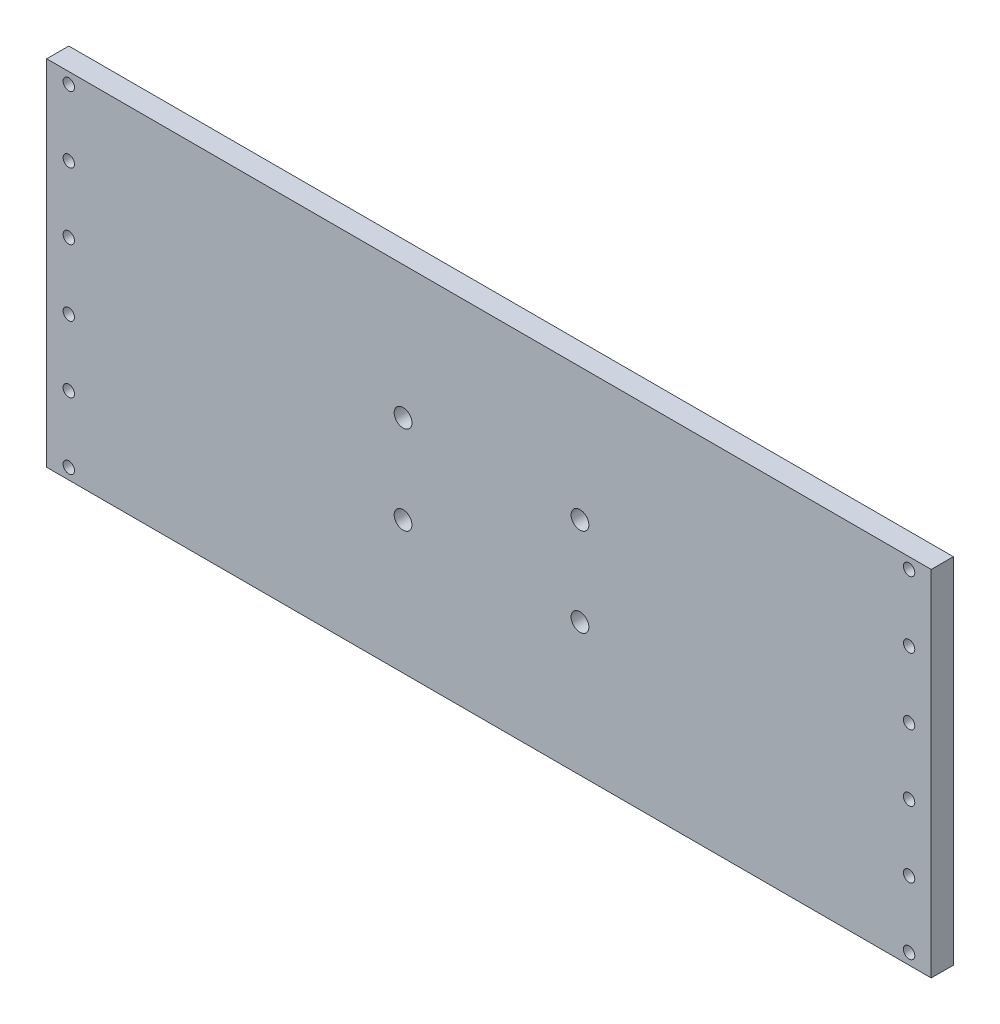
ISO-10303-21;
HEADER;
FILE_DESCRIPTION(('STEP AP214'),'2;1');
FILE_NAME('part.step','',(''),(''),'','','');
FILE_SCHEMA(('AUTOMOTIVE_DESIGN { 1 0 10303 214 1 1 1 1 }'));
ENDSEC;
DATA;
#1=APPLICATION_CONTEXT('core data for automotive mechanical design processes');
#2=APPLICATION_PROTOCOL_DEFINITION('international standard','automotive_design',2000,#1);
#3=PRODUCT_CONTEXT('',#1,'mechanical');
#4=PRODUCT('Part','Part','',(#3));
#5=PRODUCT_RELATED_PRODUCT_CATEGORY('part','',(#4));
#6=PRODUCT_DEFINITION_FORMATION('','',#4);
#7=PRODUCT_DEFINITION_CONTEXT('part definition',#1,'design');
#8=PRODUCT_DEFINITION('design','',#6,#7);
#9=PRODUCT_DEFINITION_SHAPE('','',#8);
#10=(LENGTH_UNIT() NAMED_UNIT(*) SI_UNIT(.MILLI.,.METRE.));
#11=(NAMED_UNIT(*) PLANE_ANGLE_UNIT() SI_UNIT($,.RADIAN.));
#12=(NAMED_UNIT(*) SI_UNIT($,.STERADIAN.) SOLID_ANGLE_UNIT());
#13=UNCERTAINTY_MEASURE_WITH_UNIT(LENGTH_MEASURE(1.E-05),#10,'distance_accuracy_value','');
#14=(GEOMETRIC_REPRESENTATION_CONTEXT(3) GLOBAL_UNCERTAINTY_ASSIGNED_CONTEXT((#13)) GLOBAL_UNIT_ASSIGNED_CONTEXT((#10,
#11,#12)) REPRESENTATION_CONTEXT('',''));
#15=CARTESIAN_POINT('',(0.,0.,0.));
#16=DIRECTION('',(0.,0.,1.));
#17=DIRECTION('',(1.,0.,0.));
#18=AXIS2_PLACEMENT_3D('',#15,#16,#17);
#19=CARTESIAN_POINT('',(127.,50.8,3.175));
#20=DIRECTION('',(-1.,0.,0.));
#21=DIRECTION('',(0.,0.,1.));
#22=AXIS2_PLACEMENT_3D('',#19,#20,#21);
#23=PLANE('',#22);
#24=DIRECTION('',(0.,1.,0.));
#25=VECTOR('',#24,1.);
#26=CARTESIAN_POINT('',(127.,50.8,-3.175));
#27=LINE('',#26,#25);
#28=CARTESIAN_POINT('',(127.,-50.8,-3.175));
#29=VERTEX_POINT('',#28);
#30=CARTESIAN_POINT('',(127.,50.8,-3.175));
#31=VERTEX_POINT('',#30);
#32=EDGE_CURVE('E98',#29,#31,#27,.T.);
#33=ORIENTED_EDGE('',*,*,#32,.T.);
#34=DIRECTION('',(0.,0.,-1.));
#35=VECTOR('',#34,1.);
#36=CARTESIAN_POINT('',(127.,50.8,3.175));
#37=LINE('',#36,#35);
#38=CARTESIAN_POINT('',(127.,50.8,3.175));
#39=VERTEX_POINT('',#38);
#40=EDGE_CURVE('E11',#39,#31,#37,.T.);
#41=ORIENTED_EDGE('',*,*,#40,.F.);
#42=DIRECTION('',(0.,1.,0.));
#43=VECTOR('',#42,1.);
#44=CARTESIAN_POINT('',(127.,50.8,3.175));
#45=LINE('',#44,#43);
#46=CARTESIAN_POINT('',(127.,-50.8,3.175));
#47=VERTEX_POINT('',#46);
#48=EDGE_CURVE('E86',#47,#39,#45,.T.);
#49=ORIENTED_EDGE('',*,*,#48,.F.);
#50=DIRECTION('',(0.,0.,-1.));
#51=VECTOR('',#50,1.);
#52=CARTESIAN_POINT('',(127.,-50.8,3.175));
#53=LINE('',#52,#51);
#54=EDGE_CURVE('E94',#47,#29,#53,.T.);
#55=ORIENTED_EDGE('',*,*,#54,.T.);
#56=EDGE_LOOP('',(#33,#41,#49,#55));
#57=FACE_BOUND('',#56,.T.);
#58=ADVANCED_FACE('F35',(#57),#23,.F.);
#59=CARTESIAN_POINT('',(-127.,50.8,3.175));
#60=DIRECTION('',(0.,-1.,0.));
#61=DIRECTION('',(0.,0.,-1.));
#62=AXIS2_PLACEMENT_3D('',#59,#60,#61);
#63=PLANE('',#62);
#64=DIRECTION('',(-1.,0.,0.));
#65=VECTOR('',#64,1.);
#66=CARTESIAN_POINT('',(-127.,50.8,-3.175));
#67=LINE('',#66,#65);
#68=CARTESIAN_POINT('',(-127.,50.8,-3.175));
#69=VERTEX_POINT('',#68);
#70=EDGE_CURVE('E90',#31,#69,#67,.T.);
#71=ORIENTED_EDGE('',*,*,#70,.T.);
#72=DIRECTION('',(0.,0.,-1.));
#73=VECTOR('',#72,1.);
#74=CARTESIAN_POINT('',(-127.,50.8,3.175));
#75=LINE('',#74,#73);
#76=CARTESIAN_POINT('',(-127.,50.8,3.175));
#77=VERTEX_POINT('',#76);
#78=EDGE_CURVE('E43',#77,#69,#75,.T.);
#79=ORIENTED_EDGE('',*,*,#78,.F.);
#80=DIRECTION('',(-1.,0.,0.));
#81=VECTOR('',#80,1.);
#82=CARTESIAN_POINT('',(-127.,50.8,3.175));
#83=LINE('',#82,#81);
#84=EDGE_CURVE('E81',#39,#77,#83,.T.);
#85=ORIENTED_EDGE('',*,*,#84,.F.);
#86=ORIENTED_EDGE('',*,*,#40,.T.);
#87=EDGE_LOOP('',(#71,#79,#85,#86));
#88=FACE_BOUND('',#87,.T.);
#89=ADVANCED_FACE('F89',(#88),#63,.F.);
#90=CARTESIAN_POINT('',(-127.,50.8,3.175));
#91=DIRECTION('',(1.,0.,0.));
#92=DIRECTION('',(0.,0.,-1.));
#93=AXIS2_PLACEMENT_3D('',#90,#91,#92);
#94=PLANE('',#93);
#95=DIRECTION('',(0.,-1.,0.));
#96=VECTOR('',#95,1.);
#97=CARTESIAN_POINT('',(-127.,50.8,-3.175));
#98=LINE('',#97,#96);
#99=CARTESIAN_POINT('',(-127.,-50.8,-3.175));
#100=VERTEX_POINT('',#99);
#101=EDGE_CURVE('E68',#69,#100,#98,.T.);
#102=ORIENTED_EDGE('',*,*,#101,.T.);
#103=DIRECTION('',(0.,0.,-1.));
#104=VECTOR('',#103,1.);
#105=CARTESIAN_POINT('',(-127.,-50.8,3.175));
#106=LINE('',#105,#104);
#107=CARTESIAN_POINT('',(-127.,-50.8,3.175));
#108=VERTEX_POINT('',#107);
#109=EDGE_CURVE('E91',#108,#100,#106,.T.);
#110=ORIENTED_EDGE('',*,*,#109,.F.);
#111=DIRECTION('',(0.,-1.,0.));
#112=VECTOR('',#111,1.);
#113=CARTESIAN_POINT('',(-127.,50.8,3.175));
#114=LINE('',#113,#112);
#115=EDGE_CURVE('E84',#77,#108,#114,.T.);
#116=ORIENTED_EDGE('',*,*,#115,.F.);
#117=ORIENTED_EDGE('',*,*,#78,.T.);
#118=EDGE_LOOP('',(#102,#110,#116,#117));
#119=FACE_BOUND('',#118,.T.);
#120=ADVANCED_FACE('F92',(#119),#94,.F.);
#121=CARTESIAN_POINT('',(-127.,-50.8,3.175));
#122=DIRECTION('',(0.,1.,0.));
#123=DIRECTION('',(0.,0.,1.));
#124=AXIS2_PLACEMENT_3D('',#121,#122,#123);
#125=PLANE('',#124);
#126=DIRECTION('',(1.,0.,0.));
#127=VECTOR('',#126,1.);
#128=CARTESIAN_POINT('',(-127.,-50.8,-3.175));
#129=LINE('',#128,#127);
#130=EDGE_CURVE('E74',#100,#29,#129,.T.);
#131=ORIENTED_EDGE('',*,*,#130,.T.);
#132=ORIENTED_EDGE('',*,*,#54,.F.);
#133=DIRECTION('',(1.,0.,0.));
#134=VECTOR('',#133,1.);
#135=CARTESIAN_POINT('',(-127.,-50.8,3.175));
#136=LINE('',#135,#134);
#137=EDGE_CURVE('E51',#108,#47,#136,.T.);
#138=ORIENTED_EDGE('',*,*,#137,.F.);
#139=ORIENTED_EDGE('',*,*,#109,.T.);
#140=EDGE_LOOP('',(#131,#132,#138,#139));
#141=FACE_BOUND('',#140,.T.);
#142=ADVANCED_FACE('F106',(#141),#125,.F.);
#143=CARTESIAN_POINT('',(0.,0.,3.175));
#144=DIRECTION('',(0.,0.,1.));
#145=DIRECTION('',(1.,0.,0.));
#146=AXIS2_PLACEMENT_3D('',#143,#144,#145);
#147=PLANE('',#146);
#148=CARTESIAN_POINT('',(-24.6594840209027,12.7,3.175));
#149=DIRECTION('',(0.,0.,1.));
#150=DIRECTION('',(1.,0.,0.));
#151=AXIS2_PLACEMENT_3D('',#148,#149,#150);
#152=CIRCLE('',#151,2.55269999999999);
#153=CARTESIAN_POINT('',(-22.1067840209027,12.7,3.175));
#154=VERTEX_POINT('',#153);
#155=EDGE_CURVE('E204',#154,#154,#152,.T.);
#156=ORIENTED_EDGE('',*,*,#155,.F.);
#157=EDGE_LOOP('',(#156));
#158=FACE_BOUND('',#157,.T.);
#159=CARTESIAN_POINT('',(26.1405159790973,12.7,3.175));
#160=DIRECTION('',(0.,0.,1.));
#161=DIRECTION('',(1.,0.,0.));
#162=AXIS2_PLACEMENT_3D('',#159,#160,#161);
#163=CIRCLE('',#162,2.55269999999999);
#164=CARTESIAN_POINT('',(28.6932159790973,12.7,3.175));
#165=VERTEX_POINT('',#164);
#166=EDGE_CURVE('E198',#165,#165,#163,.T.);
#167=ORIENTED_EDGE('',*,*,#166,.F.);
#168=EDGE_LOOP('',(#167));
#169=FACE_BOUND('',#168,.T.);
#170=CARTESIAN_POINT('',(26.1405159790973,-12.7,3.175));
#171=DIRECTION('',(0.,0.,1.));
#172=DIRECTION('',(1.,0.,0.));
#173=AXIS2_PLACEMENT_3D('',#170,#171,#172);
#174=CIRCLE('',#173,2.55269999999999);
#175=CARTESIAN_POINT('',(28.6932159790973,-12.7,3.175));
#176=VERTEX_POINT('',#175);
#177=EDGE_CURVE('E192',#176,#176,#174,.T.);
#178=ORIENTED_EDGE('',*,*,#177,.F.);
#179=EDGE_LOOP('',(#178));
#180=FACE_BOUND('',#179,.T.);
#181=CARTESIAN_POINT('',(-24.6594840209027,-12.7,3.175));
#182=DIRECTION('',(0.,0.,1.));
#183=DIRECTION('',(1.,0.,0.));
#184=AXIS2_PLACEMENT_3D('',#181,#182,#183);
#185=CIRCLE('',#184,2.55269999999999);
#186=CARTESIAN_POINT('',(-22.1067840209027,-12.7,3.175));
#187=VERTEX_POINT('',#186);
#188=EDGE_CURVE('E186',#187,#187,#185,.T.);
#189=ORIENTED_EDGE('',*,*,#188,.F.);
#190=EDGE_LOOP('',(#189));
#191=FACE_BOUND('',#190,.T.);
#192=CARTESIAN_POINT('',(120.65,47.625,3.175));
#193=DIRECTION('',(0.,0.,1.));
#194=DIRECTION('',(1.,0.,0.));
#195=AXIS2_PLACEMENT_3D('',#192,#193,#194);
#196=CIRCLE('',#195,1.63194999999999);
#197=CARTESIAN_POINT('',(122.28195,47.625,3.175));
#198=VERTEX_POINT('',#197);
#199=EDGE_CURVE('E180',#198,#198,#196,.T.);
#200=ORIENTED_EDGE('',*,*,#199,.F.);
#201=EDGE_LOOP('',(#200));
#202=FACE_BOUND('',#201,.T.);
#203=CARTESIAN_POINT('',(120.65,28.575,3.175));
#204=DIRECTION('',(0.,0.,1.));
#205=DIRECTION('',(1.,0.,0.));
#206=AXIS2_PLACEMENT_3D('',#203,#204,#205);
#207=CIRCLE('',#206,1.63194999999999);
#208=CARTESIAN_POINT('',(122.28195,28.575,3.175));
#209=VERTEX_POINT('',#208);
#210=EDGE_CURVE('E174',#209,#209,#207,.T.);
#211=ORIENTED_EDGE('',*,*,#210,.F.);
#212=EDGE_LOOP('',(#211));
#213=FACE_BOUND('',#212,.T.);
#214=CARTESIAN_POINT('',(120.65,9.525,3.175));
#215=DIRECTION('',(0.,0.,1.));
#216=DIRECTION('',(1.,0.,0.));
#217=AXIS2_PLACEMENT_3D('',#214,#215,#216);
#218=CIRCLE('',#217,1.63194999999999);
#219=CARTESIAN_POINT('',(122.28195,9.525,3.175));
#220=VERTEX_POINT('',#219);
#221=EDGE_CURVE('E168',#220,#220,#218,.T.);
#222=ORIENTED_EDGE('',*,*,#221,.F.);
#223=EDGE_LOOP('',(#222));
#224=FACE_BOUND('',#223,.T.);
#225=CARTESIAN_POINT('',(120.649999999999,-9.52500000000001,3.175));
#226=DIRECTION('',(0.,0.,1.));
#227=DIRECTION('',(1.,0.,0.));
#228=AXIS2_PLACEMENT_3D('',#225,#226,#227);
#229=CIRCLE('',#228,1.63194999999999);
#230=CARTESIAN_POINT('',(122.281949999999,-9.52500000000001,3.175));
#231=VERTEX_POINT('',#230);
#232=EDGE_CURVE('E162',#231,#231,#229,.T.);
#233=ORIENTED_EDGE('',*,*,#232,.F.);
#234=EDGE_LOOP('',(#233));
#235=FACE_BOUND('',#234,.T.);
#236=CARTESIAN_POINT('',(120.649999999999,-28.575,3.175));
#237=DIRECTION('',(0.,0.,1.));
#238=DIRECTION('',(1.,0.,0.));
#239=AXIS2_PLACEMENT_3D('',#236,#237,#238);
#240=CIRCLE('',#239,1.63194999999999);
#241=CARTESIAN_POINT('',(122.281949999999,-28.575,3.175));
#242=VERTEX_POINT('',#241);
#243=EDGE_CURVE('E156',#242,#242,#240,.T.);
#244=ORIENTED_EDGE('',*,*,#243,.F.);
#245=EDGE_LOOP('',(#244));
#246=FACE_BOUND('',#245,.T.);
#247=CARTESIAN_POINT('',(120.649999999999,-47.625,3.175));
#248=DIRECTION('',(0.,0.,1.));
#249=DIRECTION('',(1.,0.,0.));
#250=AXIS2_PLACEMENT_3D('',#247,#248,#249);
#251=CIRCLE('',#250,1.63194999999999);
#252=CARTESIAN_POINT('',(122.281949999999,-47.625,3.175));
#253=VERTEX_POINT('',#252);
#254=EDGE_CURVE('E150',#253,#253,#251,.T.);
#255=ORIENTED_EDGE('',*,*,#254,.F.);
#256=EDGE_LOOP('',(#255));
#257=FACE_BOUND('',#256,.T.);
#258=CARTESIAN_POINT('',(-120.65,47.625,3.175));
#259=DIRECTION('',(0.,0.,1.));
#260=DIRECTION('',(1.,0.,0.));
#261=AXIS2_PLACEMENT_3D('',#258,#259,#260);
#262=CIRCLE('',#261,1.63194999999999);
#263=CARTESIAN_POINT('',(-119.01805,47.625,3.175));
#264=VERTEX_POINT('',#263);
#265=EDGE_CURVE('E144',#264,#264,#262,.T.);
#266=ORIENTED_EDGE('',*,*,#265,.F.);
#267=EDGE_LOOP('',(#266));
#268=FACE_BOUND('',#267,.T.);
#269=CARTESIAN_POINT('',(-120.65,28.575,3.175));
#270=DIRECTION('',(0.,0.,1.));
#271=DIRECTION('',(1.,0.,0.));
#272=AXIS2_PLACEMENT_3D('',#269,#270,#271);
#273=CIRCLE('',#272,1.63194999999999);
#274=CARTESIAN_POINT('',(-119.01805,28.575,3.175));
#275=VERTEX_POINT('',#274);
#276=EDGE_CURVE('E138',#275,#275,#273,.T.);
#277=ORIENTED_EDGE('',*,*,#276,.F.);
#278=EDGE_LOOP('',(#277));
#279=FACE_BOUND('',#278,.T.);
#280=CARTESIAN_POINT('',(-120.65,9.525,3.175));
#281=DIRECTION('',(0.,0.,1.));
#282=DIRECTION('',(1.,0.,0.));
#283=AXIS2_PLACEMENT_3D('',#280,#281,#282);
#284=CIRCLE('',#283,1.63194999999999);
#285=CARTESIAN_POINT('',(-119.01805,9.525,3.175));
#286=VERTEX_POINT('',#285);
#287=EDGE_CURVE('E132',#286,#286,#284,.T.);
#288=ORIENTED_EDGE('',*,*,#287,.F.);
#289=EDGE_LOOP('',(#288));
#290=FACE_BOUND('',#289,.T.);
#291=CARTESIAN_POINT('',(-120.649999999999,-9.52500000000001,3.175));
#292=DIRECTION('',(0.,0.,1.));
#293=DIRECTION('',(1.,0.,0.));
#294=AXIS2_PLACEMENT_3D('',#291,#292,#293);
#295=CIRCLE('',#294,1.63194999999999);
#296=CARTESIAN_POINT('',(-119.018049999999,-9.52500000000001,3.175));
#297=VERTEX_POINT('',#296);
#298=EDGE_CURVE('E126',#297,#297,#295,.T.);
#299=ORIENTED_EDGE('',*,*,#298,.F.);
#300=EDGE_LOOP('',(#299));
#301=FACE_BOUND('',#300,.T.);
#302=CARTESIAN_POINT('',(-120.649999999999,-28.575,3.175));
#303=DIRECTION('',(0.,0.,1.));
#304=DIRECTION('',(1.,0.,0.));
#305=AXIS2_PLACEMENT_3D('',#302,#303,#304);
#306=CIRCLE('',#305,1.63194999999999);
#307=CARTESIAN_POINT('',(-119.018049999999,-28.575,3.175));
#308=VERTEX_POINT('',#307);
#309=EDGE_CURVE('E120',#308,#308,#306,.T.);
#310=ORIENTED_EDGE('',*,*,#309,.F.);
#311=EDGE_LOOP('',(#310));
#312=FACE_BOUND('',#311,.T.);
#313=CARTESIAN_POINT('',(-120.649999999999,-47.625,3.175));
#314=DIRECTION('',(0.,0.,1.));
#315=DIRECTION('',(1.,0.,0.));
#316=AXIS2_PLACEMENT_3D('',#313,#314,#315);
#317=CIRCLE('',#316,1.63194999999999);
#318=CARTESIAN_POINT('',(-119.018049999999,-47.625,3.175));
#319=VERTEX_POINT('',#318);
#320=EDGE_CURVE('E114',#319,#319,#317,.T.);
#321=ORIENTED_EDGE('',*,*,#320,.F.);
#322=EDGE_LOOP('',(#321));
#323=FACE_BOUND('',#322,.T.);
#324=ORIENTED_EDGE('',*,*,#48,.T.);
#325=ORIENTED_EDGE('',*,*,#84,.T.);
#326=ORIENTED_EDGE('',*,*,#115,.T.);
#327=ORIENTED_EDGE('',*,*,#137,.T.);
#328=EDGE_LOOP('',(#324,#325,#326,#327));
#329=FACE_BOUND('',#328,.T.);
#330=ADVANCED_FACE('F82',(#158,#169,#180,#191,#202,#213,#224,#235,#246,#257,#268,#279,#290,#301,
#312,#323,#329),#147,.T.);
#331=CARTESIAN_POINT('',(0.,0.,-3.175));
#332=DIRECTION('',(0.,0.,1.));
#333=DIRECTION('',(1.,0.,0.));
#334=AXIS2_PLACEMENT_3D('',#331,#332,#333);
#335=PLANE('',#334);
#336=CARTESIAN_POINT('',(-24.6594840209027,12.7,-3.175));
#337=DIRECTION('',(0.,0.,1.));
#338=DIRECTION('',(1.,0.,0.));
#339=AXIS2_PLACEMENT_3D('',#336,#337,#338);
#340=CIRCLE('',#339,2.5527);
#341=CARTESIAN_POINT('',(-22.1067840209027,12.7,-3.175));
#342=VERTEX_POINT('',#341);
#343=EDGE_CURVE('E201',#342,#342,#340,.T.);
#344=ORIENTED_EDGE('',*,*,#343,.T.);
#345=EDGE_LOOP('',(#344));
#346=FACE_BOUND('',#345,.T.);
#347=CARTESIAN_POINT('',(26.1405159790973,12.7,-3.175));
#348=DIRECTION('',(0.,0.,1.));
#349=DIRECTION('',(1.,0.,0.));
#350=AXIS2_PLACEMENT_3D('',#347,#348,#349);
#351=CIRCLE('',#350,2.5527);
#352=CARTESIAN_POINT('',(28.6932159790973,12.7,-3.175));
#353=VERTEX_POINT('',#352);
#354=EDGE_CURVE('E195',#353,#353,#351,.T.);
#355=ORIENTED_EDGE('',*,*,#354,.T.);
#356=EDGE_LOOP('',(#355));
#357=FACE_BOUND('',#356,.T.);
#358=CARTESIAN_POINT('',(26.1405159790973,-12.7,-3.175));
#359=DIRECTION('',(0.,0.,1.));
#360=DIRECTION('',(1.,0.,0.));
#361=AXIS2_PLACEMENT_3D('',#358,#359,#360);
#362=CIRCLE('',#361,2.5527);
#363=CARTESIAN_POINT('',(28.6932159790973,-12.7,-3.175));
#364=VERTEX_POINT('',#363);
#365=EDGE_CURVE('E189',#364,#364,#362,.T.);
#366=ORIENTED_EDGE('',*,*,#365,.T.);
#367=EDGE_LOOP('',(#366));
#368=FACE_BOUND('',#367,.T.);
#369=CARTESIAN_POINT('',(-24.6594840209027,-12.7,-3.175));
#370=DIRECTION('',(0.,0.,1.));
#371=DIRECTION('',(1.,0.,0.));
#372=AXIS2_PLACEMENT_3D('',#369,#370,#371);
#373=CIRCLE('',#372,2.55269999999999);
#374=CARTESIAN_POINT('',(-22.1067840209027,-12.7,-3.175));
#375=VERTEX_POINT('',#374);
#376=EDGE_CURVE('E183',#375,#375,#373,.T.);
#377=ORIENTED_EDGE('',*,*,#376,.T.);
#378=EDGE_LOOP('',(#377));
#379=FACE_BOUND('',#378,.T.);
#380=CARTESIAN_POINT('',(120.65,47.625,-3.175));
#381=DIRECTION('',(0.,0.,1.));
#382=DIRECTION('',(1.,0.,0.));
#383=AXIS2_PLACEMENT_3D('',#380,#381,#382);
#384=CIRCLE('',#383,1.63194999999999);
#385=CARTESIAN_POINT('',(122.28195,47.625,-3.175));
#386=VERTEX_POINT('',#385);
#387=EDGE_CURVE('E177',#386,#386,#384,.T.);
#388=ORIENTED_EDGE('',*,*,#387,.T.);
#389=EDGE_LOOP('',(#388));
#390=FACE_BOUND('',#389,.T.);
#391=CARTESIAN_POINT('',(120.65,28.575,-3.175));
#392=DIRECTION('',(0.,0.,1.));
#393=DIRECTION('',(1.,0.,0.));
#394=AXIS2_PLACEMENT_3D('',#391,#392,#393);
#395=CIRCLE('',#394,1.63194999999999);
#396=CARTESIAN_POINT('',(122.28195,28.575,-3.175));
#397=VERTEX_POINT('',#396);
#398=EDGE_CURVE('E171',#397,#397,#395,.T.);
#399=ORIENTED_EDGE('',*,*,#398,.T.);
#400=EDGE_LOOP('',(#399));
#401=FACE_BOUND('',#400,.T.);
#402=CARTESIAN_POINT('',(120.65,9.525,-3.175));
#403=DIRECTION('',(0.,0.,1.));
#404=DIRECTION('',(1.,0.,0.));
#405=AXIS2_PLACEMENT_3D('',#402,#403,#404);
#406=CIRCLE('',#405,1.63194999999999);
#407=CARTESIAN_POINT('',(122.28195,9.525,-3.175));
#408=VERTEX_POINT('',#407);
#409=EDGE_CURVE('E165',#408,#408,#406,.T.);
#410=ORIENTED_EDGE('',*,*,#409,.T.);
#411=EDGE_LOOP('',(#410));
#412=FACE_BOUND('',#411,.T.);
#413=CARTESIAN_POINT('',(120.649999999999,-9.52500000000001,-3.175));
#414=DIRECTION('',(0.,0.,1.));
#415=DIRECTION('',(1.,0.,0.));
#416=AXIS2_PLACEMENT_3D('',#413,#414,#415);
#417=CIRCLE('',#416,1.63194999999999);
#418=CARTESIAN_POINT('',(122.281949999999,-9.52500000000001,-3.175));
#419=VERTEX_POINT('',#418);
#420=EDGE_CURVE('E159',#419,#419,#417,.T.);
#421=ORIENTED_EDGE('',*,*,#420,.T.);
#422=EDGE_LOOP('',(#421));
#423=FACE_BOUND('',#422,.T.);
#424=CARTESIAN_POINT('',(120.649999999999,-28.575,-3.175));
#425=DIRECTION('',(0.,0.,1.));
#426=DIRECTION('',(1.,0.,0.));
#427=AXIS2_PLACEMENT_3D('',#424,#425,#426);
#428=CIRCLE('',#427,1.63194999999999);
#429=CARTESIAN_POINT('',(122.281949999999,-28.575,-3.175));
#430=VERTEX_POINT('',#429);
#431=EDGE_CURVE('E153',#430,#430,#428,.T.);
#432=ORIENTED_EDGE('',*,*,#431,.T.);
#433=EDGE_LOOP('',(#432));
#434=FACE_BOUND('',#433,.T.);
#435=CARTESIAN_POINT('',(120.649999999999,-47.625,-3.175));
#436=DIRECTION('',(0.,0.,1.));
#437=DIRECTION('',(1.,0.,0.));
#438=AXIS2_PLACEMENT_3D('',#435,#436,#437);
#439=CIRCLE('',#438,1.63194999999999);
#440=CARTESIAN_POINT('',(122.281949999999,-47.625,-3.175));
#441=VERTEX_POINT('',#440);
#442=EDGE_CURVE('E147',#441,#441,#439,.T.);
#443=ORIENTED_EDGE('',*,*,#442,.T.);
#444=EDGE_LOOP('',(#443));
#445=FACE_BOUND('',#444,.T.);
#446=CARTESIAN_POINT('',(-120.65,47.625,-3.175));
#447=DIRECTION('',(0.,0.,1.));
#448=DIRECTION('',(1.,0.,0.));
#449=AXIS2_PLACEMENT_3D('',#446,#447,#448);
#450=CIRCLE('',#449,1.63194999999999);
#451=CARTESIAN_POINT('',(-119.01805,47.625,-3.175));
#452=VERTEX_POINT('',#451);
#453=EDGE_CURVE('E141',#452,#452,#450,.T.);
#454=ORIENTED_EDGE('',*,*,#453,.T.);
#455=EDGE_LOOP('',(#454));
#456=FACE_BOUND('',#455,.T.);
#457=CARTESIAN_POINT('',(-120.65,28.575,-3.175));
#458=DIRECTION('',(0.,0.,1.));
#459=DIRECTION('',(1.,0.,0.));
#460=AXIS2_PLACEMENT_3D('',#457,#458,#459);
#461=CIRCLE('',#460,1.63194999999999);
#462=CARTESIAN_POINT('',(-119.01805,28.575,-3.175));
#463=VERTEX_POINT('',#462);
#464=EDGE_CURVE('E135',#463,#463,#461,.T.);
#465=ORIENTED_EDGE('',*,*,#464,.T.);
#466=EDGE_LOOP('',(#465));
#467=FACE_BOUND('',#466,.T.);
#468=CARTESIAN_POINT('',(-120.65,9.525,-3.175));
#469=DIRECTION('',(0.,0.,1.));
#470=DIRECTION('',(1.,0.,0.));
#471=AXIS2_PLACEMENT_3D('',#468,#469,#470);
#472=CIRCLE('',#471,1.63194999999999);
#473=CARTESIAN_POINT('',(-119.01805,9.525,-3.175));
#474=VERTEX_POINT('',#473);
#475=EDGE_CURVE('E129',#474,#474,#472,.T.);
#476=ORIENTED_EDGE('',*,*,#475,.T.);
#477=EDGE_LOOP('',(#476));
#478=FACE_BOUND('',#477,.T.);
#479=CARTESIAN_POINT('',(-120.649999999999,-9.52500000000001,-3.175));
#480=DIRECTION('',(0.,0.,1.));
#481=DIRECTION('',(1.,0.,0.));
#482=AXIS2_PLACEMENT_3D('',#479,#480,#481);
#483=CIRCLE('',#482,1.63194999999999);
#484=CARTESIAN_POINT('',(-119.018049999999,-9.52500000000001,-3.175));
#485=VERTEX_POINT('',#484);
#486=EDGE_CURVE('E123',#485,#485,#483,.T.);
#487=ORIENTED_EDGE('',*,*,#486,.T.);
#488=EDGE_LOOP('',(#487));
#489=FACE_BOUND('',#488,.T.);
#490=CARTESIAN_POINT('',(-120.649999999999,-28.575,-3.175));
#491=DIRECTION('',(0.,0.,1.));
#492=DIRECTION('',(1.,0.,0.));
#493=AXIS2_PLACEMENT_3D('',#490,#491,#492);
#494=CIRCLE('',#493,1.63194999999999);
#495=CARTESIAN_POINT('',(-119.018049999999,-28.575,-3.175));
#496=VERTEX_POINT('',#495);
#497=EDGE_CURVE('E117',#496,#496,#494,.T.);
#498=ORIENTED_EDGE('',*,*,#497,.T.);
#499=EDGE_LOOP('',(#498));
#500=FACE_BOUND('',#499,.T.);
#501=CARTESIAN_POINT('',(-120.649999999999,-47.625,-3.175));
#502=DIRECTION('',(0.,0.,1.));
#503=DIRECTION('',(1.,0.,0.));
#504=AXIS2_PLACEMENT_3D('',#501,#502,#503);
#505=CIRCLE('',#504,1.63194999999999);
#506=CARTESIAN_POINT('',(-119.018049999999,-47.625,-3.175));
#507=VERTEX_POINT('',#506);
#508=EDGE_CURVE('E101',#507,#507,#505,.T.);
#509=ORIENTED_EDGE('',*,*,#508,.T.);
#510=EDGE_LOOP('',(#509));
#511=FACE_BOUND('',#510,.T.);
#512=ORIENTED_EDGE('',*,*,#32,.F.);
#513=ORIENTED_EDGE('',*,*,#130,.F.);
#514=ORIENTED_EDGE('',*,*,#101,.F.);
#515=ORIENTED_EDGE('',*,*,#70,.F.);
#516=EDGE_LOOP('',(#512,#513,#514,#515));
#517=FACE_BOUND('',#516,.T.);
#518=ADVANCED_FACE('F109',(#346,#357,#368,#379,#390,#401,#412,#423,#434,#445,#456,#467,#478,
#489,#500,#511,#517),#335,.F.);
#519=CARTESIAN_POINT('',(-120.649999999999,-47.625,3.175));
#520=DIRECTION('',(0.,0.,1.));
#521=DIRECTION('',(1.,0.,0.));
#522=AXIS2_PLACEMENT_3D('',#519,#520,#521);
#523=CYLINDRICAL_SURFACE('',#522,1.63194999999999);
#524=ORIENTED_EDGE('',*,*,#508,.F.);
#525=EDGE_LOOP('',(#524));
#526=FACE_BOUND('',#525,.T.);
#527=ORIENTED_EDGE('',*,*,#320,.T.);
#528=EDGE_LOOP('',(#527));
#529=FACE_BOUND('',#528,.T.);
#530=ADVANCED_FACE('F243',(#526,#529),#523,.F.);
#531=CARTESIAN_POINT('',(-120.649999999999,-28.575,3.175));
#532=DIRECTION('',(0.,0.,1.));
#533=DIRECTION('',(1.,0.,0.));
#534=AXIS2_PLACEMENT_3D('',#531,#532,#533);
#535=CYLINDRICAL_SURFACE('',#534,1.63194999999999);
#536=ORIENTED_EDGE('',*,*,#497,.F.);
#537=EDGE_LOOP('',(#536));
#538=FACE_BOUND('',#537,.T.);
#539=ORIENTED_EDGE('',*,*,#309,.T.);
#540=EDGE_LOOP('',(#539));
#541=FACE_BOUND('',#540,.T.);
#542=ADVANCED_FACE('F245',(#538,#541),#535,.F.);
#543=CARTESIAN_POINT('',(-120.649999999999,-9.52500000000001,3.175));
#544=DIRECTION('',(0.,0.,1.));
#545=DIRECTION('',(1.,0.,0.));
#546=AXIS2_PLACEMENT_3D('',#543,#544,#545);
#547=CYLINDRICAL_SURFACE('',#546,1.63194999999999);
#548=ORIENTED_EDGE('',*,*,#486,.F.);
#549=EDGE_LOOP('',(#548));
#550=FACE_BOUND('',#549,.T.);
#551=ORIENTED_EDGE('',*,*,#298,.T.);
#552=EDGE_LOOP('',(#551));
#553=FACE_BOUND('',#552,.T.);
#554=ADVANCED_FACE('F252',(#550,#553),#547,.F.);
#555=CARTESIAN_POINT('',(-120.65,9.525,3.175));
#556=DIRECTION('',(0.,0.,1.));
#557=DIRECTION('',(1.,0.,0.));
#558=AXIS2_PLACEMENT_3D('',#555,#556,#557);
#559=CYLINDRICAL_SURFACE('',#558,1.63194999999999);
#560=ORIENTED_EDGE('',*,*,#475,.F.);
#561=EDGE_LOOP('',(#560));
#562=FACE_BOUND('',#561,.T.);
#563=ORIENTED_EDGE('',*,*,#287,.T.);
#564=EDGE_LOOP('',(#563));
#565=FACE_BOUND('',#564,.T.);
#566=ADVANCED_FACE('F361',(#562,#565),#559,.F.);
#567=CARTESIAN_POINT('',(-120.65,28.575,3.175));
#568=DIRECTION('',(0.,0.,1.));
#569=DIRECTION('',(1.,0.,0.));
#570=AXIS2_PLACEMENT_3D('',#567,#568,#569);
#571=CYLINDRICAL_SURFACE('',#570,1.63194999999999);
#572=ORIENTED_EDGE('',*,*,#464,.F.);
#573=EDGE_LOOP('',(#572));
#574=FACE_BOUND('',#573,.T.);
#575=ORIENTED_EDGE('',*,*,#276,.T.);
#576=EDGE_LOOP('',(#575));
#577=FACE_BOUND('',#576,.T.);
#578=ADVANCED_FACE('F357',(#574,#577),#571,.F.);
#579=CARTESIAN_POINT('',(-120.65,47.625,3.175));
#580=DIRECTION('',(0.,0.,1.));
#581=DIRECTION('',(1.,0.,0.));
#582=AXIS2_PLACEMENT_3D('',#579,#580,#581);
#583=CYLINDRICAL_SURFACE('',#582,1.63194999999999);
#584=ORIENTED_EDGE('',*,*,#453,.F.);
#585=EDGE_LOOP('',(#584));
#586=FACE_BOUND('',#585,.T.);
#587=ORIENTED_EDGE('',*,*,#265,.T.);
#588=EDGE_LOOP('',(#587));
#589=FACE_BOUND('',#588,.T.);
#590=ADVANCED_FACE('F353',(#586,#589),#583,.F.);
#591=CARTESIAN_POINT('',(120.649999999999,-47.625,3.175));
#592=DIRECTION('',(0.,0.,1.));
#593=DIRECTION('',(1.,0.,0.));
#594=AXIS2_PLACEMENT_3D('',#591,#592,#593);
#595=CYLINDRICAL_SURFACE('',#594,1.63194999999999);
#596=ORIENTED_EDGE('',*,*,#442,.F.);
#597=EDGE_LOOP('',(#596));
#598=FACE_BOUND('',#597,.T.);
#599=ORIENTED_EDGE('',*,*,#254,.T.);
#600=EDGE_LOOP('',(#599));
#601=FACE_BOUND('',#600,.T.);
#602=ADVANCED_FACE('F349',(#598,#601),#595,.F.);
#603=CARTESIAN_POINT('',(120.649999999999,-28.575,3.175));
#604=DIRECTION('',(0.,0.,1.));
#605=DIRECTION('',(1.,0.,0.));
#606=AXIS2_PLACEMENT_3D('',#603,#604,#605);
#607=CYLINDRICAL_SURFACE('',#606,1.63194999999999);
#608=ORIENTED_EDGE('',*,*,#431,.F.);
#609=EDGE_LOOP('',(#608));
#610=FACE_BOUND('',#609,.T.);
#611=ORIENTED_EDGE('',*,*,#243,.T.);
#612=EDGE_LOOP('',(#611));
#613=FACE_BOUND('',#612,.T.);
#614=ADVANCED_FACE('F345',(#610,#613),#607,.F.);
#615=CARTESIAN_POINT('',(120.649999999999,-9.52500000000001,3.175));
#616=DIRECTION('',(0.,0.,1.));
#617=DIRECTION('',(1.,0.,0.));
#618=AXIS2_PLACEMENT_3D('',#615,#616,#617);
#619=CYLINDRICAL_SURFACE('',#618,1.63194999999999);
#620=ORIENTED_EDGE('',*,*,#420,.F.);
#621=EDGE_LOOP('',(#620));
#622=FACE_BOUND('',#621,.T.);
#623=ORIENTED_EDGE('',*,*,#232,.T.);
#624=EDGE_LOOP('',(#623));
#625=FACE_BOUND('',#624,.T.);
#626=ADVANCED_FACE('F341',(#622,#625),#619,.F.);
#627=CARTESIAN_POINT('',(120.65,9.525,3.175));
#628=DIRECTION('',(0.,0.,1.));
#629=DIRECTION('',(1.,0.,0.));
#630=AXIS2_PLACEMENT_3D('',#627,#628,#629);
#631=CYLINDRICAL_SURFACE('',#630,1.63194999999999);
#632=ORIENTED_EDGE('',*,*,#409,.F.);
#633=EDGE_LOOP('',(#632));
#634=FACE_BOUND('',#633,.T.);
#635=ORIENTED_EDGE('',*,*,#221,.T.);
#636=EDGE_LOOP('',(#635));
#637=FACE_BOUND('',#636,.T.);
#638=ADVANCED_FACE('F337',(#634,#637),#631,.F.);
#639=CARTESIAN_POINT('',(120.65,28.575,3.175));
#640=DIRECTION('',(0.,0.,1.));
#641=DIRECTION('',(1.,0.,0.));
#642=AXIS2_PLACEMENT_3D('',#639,#640,#641);
#643=CYLINDRICAL_SURFACE('',#642,1.63194999999999);
#644=ORIENTED_EDGE('',*,*,#398,.F.);
#645=EDGE_LOOP('',(#644));
#646=FACE_BOUND('',#645,.T.);
#647=ORIENTED_EDGE('',*,*,#210,.T.);
#648=EDGE_LOOP('',(#647));
#649=FACE_BOUND('',#648,.T.);
#650=ADVANCED_FACE('F333',(#646,#649),#643,.F.);
#651=CARTESIAN_POINT('',(120.65,47.625,3.175));
#652=DIRECTION('',(0.,0.,1.));
#653=DIRECTION('',(1.,0.,0.));
#654=AXIS2_PLACEMENT_3D('',#651,#652,#653);
#655=CYLINDRICAL_SURFACE('',#654,1.63194999999999);
#656=ORIENTED_EDGE('',*,*,#387,.F.);
#657=EDGE_LOOP('',(#656));
#658=FACE_BOUND('',#657,.T.);
#659=ORIENTED_EDGE('',*,*,#199,.T.);
#660=EDGE_LOOP('',(#659));
#661=FACE_BOUND('',#660,.T.);
#662=ADVANCED_FACE('F295',(#658,#661),#655,.F.);
#663=CARTESIAN_POINT('',(-24.6594840209027,-12.7,3.175));
#664=DIRECTION('',(0.,0.,1.));
#665=DIRECTION('',(1.,0.,0.));
#666=AXIS2_PLACEMENT_3D('',#663,#664,#665);
#667=CYLINDRICAL_SURFACE('',#666,2.55269999999999);
#668=ORIENTED_EDGE('',*,*,#376,.F.);
#669=EDGE_LOOP('',(#668));
#670=FACE_BOUND('',#669,.T.);
#671=ORIENTED_EDGE('',*,*,#188,.T.);
#672=EDGE_LOOP('',(#671));
#673=FACE_BOUND('',#672,.T.);
#674=ADVANCED_FACE('F289',(#670,#673),#667,.F.);
#675=CARTESIAN_POINT('',(26.1405159790973,-12.7,3.175));
#676=DIRECTION('',(0.,0.,1.));
#677=DIRECTION('',(1.,0.,0.));
#678=AXIS2_PLACEMENT_3D('',#675,#676,#677);
#679=CYLINDRICAL_SURFACE('',#678,2.55269999999999);
#680=ORIENTED_EDGE('',*,*,#365,.F.);
#681=EDGE_LOOP('',(#680));
#682=FACE_BOUND('',#681,.T.);
#683=ORIENTED_EDGE('',*,*,#177,.T.);
#684=EDGE_LOOP('',(#683));
#685=FACE_BOUND('',#684,.T.);
#686=ADVANCED_FACE('F294',(#682,#685),#679,.F.);
#687=CARTESIAN_POINT('',(26.1405159790973,12.7,3.175));
#688=DIRECTION('',(0.,0.,1.));
#689=DIRECTION('',(1.,0.,0.));
#690=AXIS2_PLACEMENT_3D('',#687,#688,#689);
#691=CYLINDRICAL_SURFACE('',#690,2.55269999999999);
#692=ORIENTED_EDGE('',*,*,#354,.F.);
#693=EDGE_LOOP('',(#692));
#694=FACE_BOUND('',#693,.T.);
#695=ORIENTED_EDGE('',*,*,#166,.T.);
#696=EDGE_LOOP('',(#695));
#697=FACE_BOUND('',#696,.T.);
#698=ADVANCED_FACE('F307',(#694,#697),#691,.F.);
#699=CARTESIAN_POINT('',(-24.6594840209027,12.7,3.175));
#700=DIRECTION('',(0.,0.,1.));
#701=DIRECTION('',(1.,0.,0.));
#702=AXIS2_PLACEMENT_3D('',#699,#700,#701);
#703=CYLINDRICAL_SURFACE('',#702,2.55269999999999);
#704=ORIENTED_EDGE('',*,*,#343,.F.);
#705=EDGE_LOOP('',(#704));
#706=FACE_BOUND('',#705,.T.);
#707=ORIENTED_EDGE('',*,*,#155,.T.);
#708=EDGE_LOOP('',(#707));
#709=FACE_BOUND('',#708,.T.);
#710=ADVANCED_FACE('F208',(#706,#709),#703,.F.);
#711=CLOSED_SHELL('',(#58,#89,#120,#142,#330,#518,#530,#542,#554,#566,#578,#590,#602,#614,#626,
#638,#650,#662,#674,#686,#698,#710));
#712=MANIFOLD_SOLID_BREP('B2',#711);
#713=ADVANCED_BREP_SHAPE_REPRESENTATION('',(#18,#712),#14);
#714=SHAPE_DEFINITION_REPRESENTATION(#9,#713);
ENDSEC;
END-ISO-10303-21;
